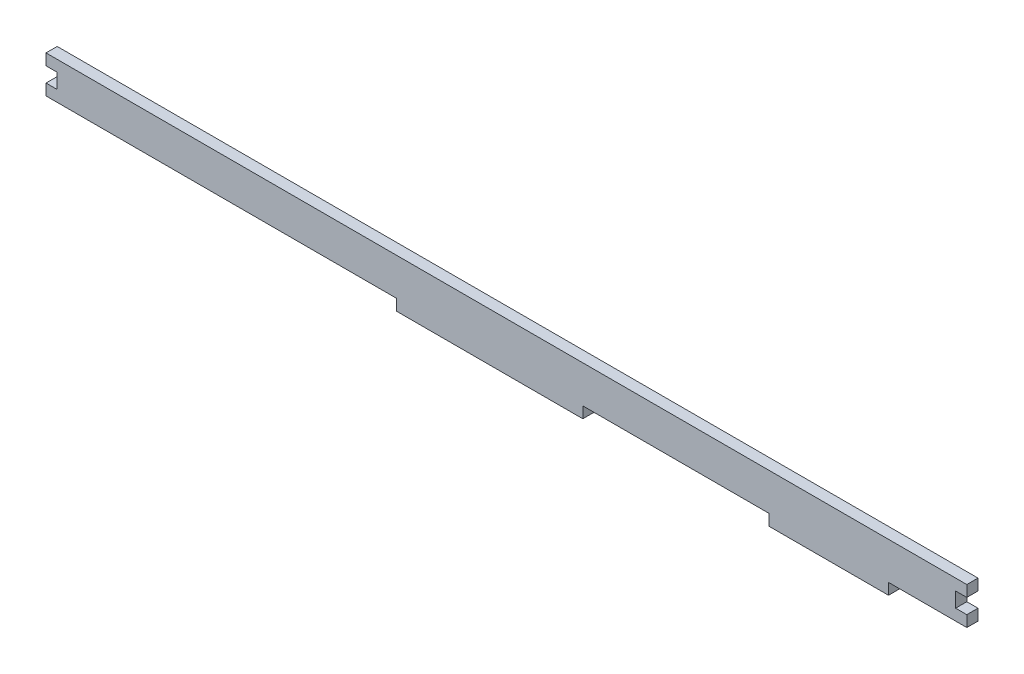
ISO-10303-21;
HEADER;
FILE_DESCRIPTION(('STEP AP214'),'2;1');
FILE_NAME('part.step','',(''),(''),'','','');
FILE_SCHEMA(('AUTOMOTIVE_DESIGN { 1 0 10303 214 1 1 1 1 }'));
ENDSEC;
DATA;
#1=APPLICATION_CONTEXT('core data for automotive mechanical design processes');
#2=APPLICATION_PROTOCOL_DEFINITION('international standard','automotive_design',2000,#1);
#3=PRODUCT_CONTEXT('',#1,'mechanical');
#4=PRODUCT('Part','Part','',(#3));
#5=PRODUCT_RELATED_PRODUCT_CATEGORY('part','',(#4));
#6=PRODUCT_DEFINITION_FORMATION('','',#4);
#7=PRODUCT_DEFINITION_CONTEXT('part definition',#1,'design');
#8=PRODUCT_DEFINITION('design','',#6,#7);
#9=PRODUCT_DEFINITION_SHAPE('','',#8);
#10=(LENGTH_UNIT() NAMED_UNIT(*) SI_UNIT(.MILLI.,.METRE.));
#11=(NAMED_UNIT(*) PLANE_ANGLE_UNIT() SI_UNIT($,.RADIAN.));
#12=(NAMED_UNIT(*) SI_UNIT($,.STERADIAN.) SOLID_ANGLE_UNIT());
#13=UNCERTAINTY_MEASURE_WITH_UNIT(LENGTH_MEASURE(1.E-05),#10,'distance_accuracy_value','');
#14=(GEOMETRIC_REPRESENTATION_CONTEXT(3) GLOBAL_UNCERTAINTY_ASSIGNED_CONTEXT((#13)) GLOBAL_UNIT_ASSIGNED_CONTEXT((#10,
#11,#12)) REPRESENTATION_CONTEXT('',''));
#15=CARTESIAN_POINT('',(0.,0.,0.));
#16=DIRECTION('',(0.,0.,1.));
#17=DIRECTION('',(1.,0.,0.));
#18=AXIS2_PLACEMENT_3D('',#15,#16,#17);
#19=CARTESIAN_POINT('',(247.,10.,3.));
#20=DIRECTION('',(-1.,0.,0.));
#21=DIRECTION('',(0.,0.,1.));
#22=AXIS2_PLACEMENT_3D('',#19,#20,#21);
#23=PLANE('',#22);
#24=DIRECTION('',(0.,1.,0.));
#25=VECTOR('',#24,1.);
#26=CARTESIAN_POINT('',(247.,10.,0.));
#27=LINE('',#26,#25);
#28=CARTESIAN_POINT('',(247.,7.,0.));
#29=VERTEX_POINT('',#28);
#30=CARTESIAN_POINT('',(247.,10.,0.));
#31=VERTEX_POINT('',#30);
#32=EDGE_CURVE('E202',#29,#31,#27,.T.);
#33=ORIENTED_EDGE('',*,*,#32,.T.);
#34=DIRECTION('',(0.,0.,-1.));
#35=VECTOR('',#34,1.);
#36=CARTESIAN_POINT('',(247.,10.,3.));
#37=LINE('',#36,#35);
#38=CARTESIAN_POINT('',(247.,10.,3.));
#39=VERTEX_POINT('',#38);
#40=EDGE_CURVE('E11',#39,#31,#37,.T.);
#41=ORIENTED_EDGE('',*,*,#40,.F.);
#42=DIRECTION('',(0.,1.,0.));
#43=VECTOR('',#42,1.);
#44=CARTESIAN_POINT('',(247.,10.,3.));
#45=LINE('',#44,#43);
#46=CARTESIAN_POINT('',(247.,7.,3.));
#47=VERTEX_POINT('',#46);
#48=EDGE_CURVE('E240',#47,#39,#45,.T.);
#49=ORIENTED_EDGE('',*,*,#48,.F.);
#50=DIRECTION('',(0.,0.,-1.));
#51=VECTOR('',#50,1.);
#52=CARTESIAN_POINT('',(247.,7.,3.));
#53=LINE('',#52,#51);
#54=EDGE_CURVE('E198',#47,#29,#53,.T.);
#55=ORIENTED_EDGE('',*,*,#54,.T.);
#56=EDGE_LOOP('',(#33,#41,#49,#55));
#57=FACE_BOUND('',#56,.T.);
#58=ADVANCED_FACE('F34',(#57),#23,.F.);
#59=CARTESIAN_POINT('',(0.,10.,3.));
#60=DIRECTION('',(0.,-1.,0.));
#61=DIRECTION('',(1.,0.,0.));
#62=AXIS2_PLACEMENT_3D('',#59,#60,#61);
#63=PLANE('',#62);
#64=DIRECTION('',(-1.,0.,0.));
#65=VECTOR('',#64,1.);
#66=CARTESIAN_POINT('',(0.,10.,0.));
#67=LINE('',#66,#65);
#68=CARTESIAN_POINT('',(0.,10.,0.));
#69=VERTEX_POINT('',#68);
#70=EDGE_CURVE('E205',#31,#69,#67,.T.);
#71=ORIENTED_EDGE('',*,*,#70,.T.);
#72=DIRECTION('',(0.,0.,-1.));
#73=VECTOR('',#72,1.);
#74=CARTESIAN_POINT('',(0.,10.,3.));
#75=LINE('',#74,#73);
#76=CARTESIAN_POINT('',(0.,10.,3.));
#77=VERTEX_POINT('',#76);
#78=EDGE_CURVE('E42',#77,#69,#75,.T.);
#79=ORIENTED_EDGE('',*,*,#78,.F.);
#80=DIRECTION('',(-1.,0.,0.));
#81=VECTOR('',#80,1.);
#82=CARTESIAN_POINT('',(244.,10.,3.));
#83=LINE('',#82,#81);
#84=EDGE_CURVE('E129',#39,#77,#83,.T.);
#85=ORIENTED_EDGE('',*,*,#84,.F.);
#86=ORIENTED_EDGE('',*,*,#40,.T.);
#87=EDGE_LOOP('',(#71,#79,#85,#86));
#88=FACE_BOUND('',#87,.T.);
#89=ADVANCED_FACE('F358',(#88),#63,.F.);
#90=CARTESIAN_POINT('',(0.,10.,3.));
#91=DIRECTION('',(1.,0.,0.));
#92=DIRECTION('',(0.,1.,0.));
#93=AXIS2_PLACEMENT_3D('',#90,#91,#92);
#94=PLANE('',#93);
#95=DIRECTION('',(0.,-1.,0.));
#96=VECTOR('',#95,1.);
#97=CARTESIAN_POINT('',(0.,10.,0.));
#98=LINE('',#97,#96);
#99=CARTESIAN_POINT('',(0.,6.99999999999999,0.));
#100=VERTEX_POINT('',#99);
#101=EDGE_CURVE('E207',#69,#100,#98,.T.);
#102=ORIENTED_EDGE('',*,*,#101,.T.);
#103=DIRECTION('',(0.,0.,-1.));
#104=VECTOR('',#103,1.);
#105=CARTESIAN_POINT('',(0.,6.99999999999999,3.));
#106=LINE('',#105,#104);
#107=CARTESIAN_POINT('',(0.,6.99999999999999,3.));
#108=VERTEX_POINT('',#107);
#109=EDGE_CURVE('E283',#108,#100,#106,.T.);
#110=ORIENTED_EDGE('',*,*,#109,.F.);
#111=DIRECTION('',(0.,-1.,0.));
#112=VECTOR('',#111,1.);
#113=CARTESIAN_POINT('',(0.,10.,3.));
#114=LINE('',#113,#112);
#115=EDGE_CURVE('E291',#77,#108,#114,.T.);
#116=ORIENTED_EDGE('',*,*,#115,.F.);
#117=ORIENTED_EDGE('',*,*,#78,.T.);
#118=EDGE_LOOP('',(#102,#110,#116,#117));
#119=FACE_BOUND('',#118,.T.);
#120=ADVANCED_FACE('F289',(#119),#94,.F.);
#121=CARTESIAN_POINT('',(0.,6.99999999999999,3.));
#122=DIRECTION('',(0.,1.,0.));
#123=DIRECTION('',(0.,0.,1.));
#124=AXIS2_PLACEMENT_3D('',#121,#122,#123);
#125=PLANE('',#124);
#126=DIRECTION('',(1.,0.,0.));
#127=VECTOR('',#126,1.);
#128=CARTESIAN_POINT('',(0.,6.99999999999999,0.));
#129=LINE('',#128,#127);
#130=CARTESIAN_POINT('',(3.,6.99999999999999,0.));
#131=VERTEX_POINT('',#130);
#132=EDGE_CURVE('E209',#100,#131,#129,.T.);
#133=ORIENTED_EDGE('',*,*,#132,.T.);
#134=DIRECTION('',(0.,0.,-1.));
#135=VECTOR('',#134,1.);
#136=CARTESIAN_POINT('',(3.,6.99999999999999,3.));
#137=LINE('',#136,#135);
#138=CARTESIAN_POINT('',(3.,6.99999999999999,3.));
#139=VERTEX_POINT('',#138);
#140=EDGE_CURVE('E280',#139,#131,#137,.T.);
#141=ORIENTED_EDGE('',*,*,#140,.F.);
#142=DIRECTION('',(1.,0.,0.));
#143=VECTOR('',#142,1.);
#144=CARTESIAN_POINT('',(0.,6.99999999999999,3.));
#145=LINE('',#144,#143);
#146=EDGE_CURVE('E309',#108,#139,#145,.T.);
#147=ORIENTED_EDGE('',*,*,#146,.F.);
#148=ORIENTED_EDGE('',*,*,#109,.T.);
#149=EDGE_LOOP('',(#133,#141,#147,#148));
#150=FACE_BOUND('',#149,.T.);
#151=ADVANCED_FACE('F300',(#150),#125,.F.);
#152=CARTESIAN_POINT('',(3.,6.99999999999999,3.));
#153=DIRECTION('',(1.,0.,0.));
#154=DIRECTION('',(0.,0.,-1.));
#155=AXIS2_PLACEMENT_3D('',#152,#153,#154);
#156=PLANE('',#155);
#157=DIRECTION('',(0.,-1.,0.));
#158=VECTOR('',#157,1.);
#159=CARTESIAN_POINT('',(3.,6.99999999999999,0.));
#160=LINE('',#159,#158);
#161=CARTESIAN_POINT('',(3.,2.99999999999992,0.));
#162=VERTEX_POINT('',#161);
#163=EDGE_CURVE('E211',#131,#162,#160,.T.);
#164=ORIENTED_EDGE('',*,*,#163,.T.);
#165=DIRECTION('',(0.,0.,-1.));
#166=VECTOR('',#165,1.);
#167=CARTESIAN_POINT('',(3.,2.99999999999992,3.));
#168=LINE('',#167,#166);
#169=CARTESIAN_POINT('',(3.,2.99999999999992,3.));
#170=VERTEX_POINT('',#169);
#171=EDGE_CURVE('E277',#170,#162,#168,.T.);
#172=ORIENTED_EDGE('',*,*,#171,.F.);
#173=DIRECTION('',(0.,-1.,0.));
#174=VECTOR('',#173,1.);
#175=CARTESIAN_POINT('',(3.,6.99999999999999,3.));
#176=LINE('',#175,#174);
#177=EDGE_CURVE('E306',#139,#170,#176,.T.);
#178=ORIENTED_EDGE('',*,*,#177,.F.);
#179=ORIENTED_EDGE('',*,*,#140,.T.);
#180=EDGE_LOOP('',(#164,#172,#178,#179));
#181=FACE_BOUND('',#180,.T.);
#182=ADVANCED_FACE('F304',(#181),#156,.F.);
#183=CARTESIAN_POINT('',(0.,2.99999999999992,3.));
#184=DIRECTION('',(0.,-1.,0.));
#185=DIRECTION('',(1.,0.,0.));
#186=AXIS2_PLACEMENT_3D('',#183,#184,#185);
#187=PLANE('',#186);
#188=DIRECTION('',(-1.,0.,0.));
#189=VECTOR('',#188,1.);
#190=CARTESIAN_POINT('',(0.,2.99999999999992,0.));
#191=LINE('',#190,#189);
#192=CARTESIAN_POINT('',(0.,2.99999999999992,0.));
#193=VERTEX_POINT('',#192);
#194=EDGE_CURVE('E213',#162,#193,#191,.T.);
#195=ORIENTED_EDGE('',*,*,#194,.T.);
#196=DIRECTION('',(0.,0.,-1.));
#197=VECTOR('',#196,1.);
#198=CARTESIAN_POINT('',(0.,2.99999999999992,3.));
#199=LINE('',#198,#197);
#200=CARTESIAN_POINT('',(0.,2.99999999999992,3.));
#201=VERTEX_POINT('',#200);
#202=EDGE_CURVE('E274',#201,#193,#199,.T.);
#203=ORIENTED_EDGE('',*,*,#202,.F.);
#204=DIRECTION('',(-1.,0.,0.));
#205=VECTOR('',#204,1.);
#206=CARTESIAN_POINT('',(0.,2.99999999999992,3.));
#207=LINE('',#206,#205);
#208=EDGE_CURVE('E308',#170,#201,#207,.T.);
#209=ORIENTED_EDGE('',*,*,#208,.F.);
#210=ORIENTED_EDGE('',*,*,#171,.T.);
#211=EDGE_LOOP('',(#195,#203,#209,#210));
#212=FACE_BOUND('',#211,.T.);
#213=ADVANCED_FACE('F371',(#212),#187,.F.);
#214=CARTESIAN_POINT('',(0.,2.99999999999992,3.));
#215=DIRECTION('',(1.,0.,0.));
#216=DIRECTION('',(0.,0.,-1.));
#217=AXIS2_PLACEMENT_3D('',#214,#215,#216);
#218=PLANE('',#217);
#219=DIRECTION('',(0.,-1.,0.));
#220=VECTOR('',#219,1.);
#221=CARTESIAN_POINT('',(0.,2.99999999999992,0.));
#222=LINE('',#221,#220);
#223=CARTESIAN_POINT('',(0.,0.,0.));
#224=VERTEX_POINT('',#223);
#225=EDGE_CURVE('E215',#193,#224,#222,.T.);
#226=ORIENTED_EDGE('',*,*,#225,.T.);
#227=DIRECTION('',(0.,0.,-1.));
#228=VECTOR('',#227,1.);
#229=CARTESIAN_POINT('',(0.,0.,3.));
#230=LINE('',#229,#228);
#231=CARTESIAN_POINT('',(0.,0.,3.));
#232=VERTEX_POINT('',#231);
#233=EDGE_CURVE('E271',#232,#224,#230,.T.);
#234=ORIENTED_EDGE('',*,*,#233,.F.);
#235=DIRECTION('',(0.,-1.,0.));
#236=VECTOR('',#235,1.);
#237=CARTESIAN_POINT('',(0.,2.99999999999992,3.));
#238=LINE('',#237,#236);
#239=EDGE_CURVE('E311',#201,#232,#238,.T.);
#240=ORIENTED_EDGE('',*,*,#239,.F.);
#241=ORIENTED_EDGE('',*,*,#202,.T.);
#242=EDGE_LOOP('',(#226,#234,#240,#241));
#243=FACE_BOUND('',#242,.T.);
#244=ADVANCED_FACE('F374',(#243),#218,.F.);
#245=CARTESIAN_POINT('',(94.,0.,3.));
#246=DIRECTION('',(0.,1.,0.));
#247=DIRECTION('',(-1.,0.,0.));
#248=AXIS2_PLACEMENT_3D('',#245,#246,#247);
#249=PLANE('',#248);
#250=DIRECTION('',(1.,0.,0.));
#251=VECTOR('',#250,1.);
#252=CARTESIAN_POINT('',(94.,0.,0.));
#253=LINE('',#252,#251);
#254=CARTESIAN_POINT('',(94.,0.,0.));
#255=VERTEX_POINT('',#254);
#256=EDGE_CURVE('E217',#224,#255,#253,.T.);
#257=ORIENTED_EDGE('',*,*,#256,.T.);
#258=DIRECTION('',(0.,0.,-1.));
#259=VECTOR('',#258,1.);
#260=CARTESIAN_POINT('',(94.,0.,3.));
#261=LINE('',#260,#259);
#262=CARTESIAN_POINT('',(94.,0.,3.));
#263=VERTEX_POINT('',#262);
#264=EDGE_CURVE('E268',#263,#255,#261,.T.);
#265=ORIENTED_EDGE('',*,*,#264,.F.);
#266=DIRECTION('',(1.,0.,0.));
#267=VECTOR('',#266,1.);
#268=CARTESIAN_POINT('',(94.,0.,3.));
#269=LINE('',#268,#267);
#270=EDGE_CURVE('E317',#232,#263,#269,.T.);
#271=ORIENTED_EDGE('',*,*,#270,.F.);
#272=ORIENTED_EDGE('',*,*,#233,.T.);
#273=EDGE_LOOP('',(#257,#265,#271,#272));
#274=FACE_BOUND('',#273,.T.);
#275=ADVANCED_FACE('F378',(#274),#249,.F.);
#276=CARTESIAN_POINT('',(94.,0.,3.));
#277=DIRECTION('',(1.,0.,0.));
#278=DIRECTION('',(0.,0.,-1.));
#279=AXIS2_PLACEMENT_3D('',#276,#277,#278);
#280=PLANE('',#279);
#281=DIRECTION('',(0.,-1.,0.));
#282=VECTOR('',#281,1.);
#283=CARTESIAN_POINT('',(94.,0.,0.));
#284=LINE('',#283,#282);
#285=CARTESIAN_POINT('',(94.,-2.99999999999999,0.));
#286=VERTEX_POINT('',#285);
#287=EDGE_CURVE('E219',#255,#286,#284,.T.);
#288=ORIENTED_EDGE('',*,*,#287,.T.);
#289=DIRECTION('',(0.,0.,-1.));
#290=VECTOR('',#289,1.);
#291=CARTESIAN_POINT('',(94.,-2.99999999999999,3.));
#292=LINE('',#291,#290);
#293=CARTESIAN_POINT('',(94.,-2.99999999999999,3.));
#294=VERTEX_POINT('',#293);
#295=EDGE_CURVE('E265',#294,#286,#292,.T.);
#296=ORIENTED_EDGE('',*,*,#295,.F.);
#297=DIRECTION('',(0.,-1.,0.));
#298=VECTOR('',#297,1.);
#299=CARTESIAN_POINT('',(94.,0.,3.));
#300=LINE('',#299,#298);
#301=EDGE_CURVE('E319',#263,#294,#300,.T.);
#302=ORIENTED_EDGE('',*,*,#301,.F.);
#303=ORIENTED_EDGE('',*,*,#264,.T.);
#304=EDGE_LOOP('',(#288,#296,#302,#303));
#305=FACE_BOUND('',#304,.T.);
#306=ADVANCED_FACE('F382',(#305),#280,.F.);
#307=CARTESIAN_POINT('',(94.,-2.99999999999999,3.));
#308=DIRECTION('',(0.,1.,0.));
#309=DIRECTION('',(-1.,0.,0.));
#310=AXIS2_PLACEMENT_3D('',#307,#308,#309);
#311=PLANE('',#310);
#312=DIRECTION('',(1.,0.,0.));
#313=VECTOR('',#312,1.);
#314=CARTESIAN_POINT('',(94.,-2.99999999999999,0.));
#315=LINE('',#314,#313);
#316=CARTESIAN_POINT('',(144.,-2.99999999999999,0.));
#317=VERTEX_POINT('',#316);
#318=EDGE_CURVE('E221',#286,#317,#315,.T.);
#319=ORIENTED_EDGE('',*,*,#318,.T.);
#320=DIRECTION('',(0.,0.,-1.));
#321=VECTOR('',#320,1.);
#322=CARTESIAN_POINT('',(144.,-2.99999999999999,3.));
#323=LINE('',#322,#321);
#324=CARTESIAN_POINT('',(144.,-2.99999999999999,3.));
#325=VERTEX_POINT('',#324);
#326=EDGE_CURVE('E262',#325,#317,#323,.T.);
#327=ORIENTED_EDGE('',*,*,#326,.F.);
#328=DIRECTION('',(1.,0.,0.));
#329=VECTOR('',#328,1.);
#330=CARTESIAN_POINT('',(94.,-2.99999999999999,3.));
#331=LINE('',#330,#329);
#332=EDGE_CURVE('E321',#294,#325,#331,.T.);
#333=ORIENTED_EDGE('',*,*,#332,.F.);
#334=ORIENTED_EDGE('',*,*,#295,.T.);
#335=EDGE_LOOP('',(#319,#327,#333,#334));
#336=FACE_BOUND('',#335,.T.);
#337=ADVANCED_FACE('F386',(#336),#311,.F.);
#338=CARTESIAN_POINT('',(144.,0.,3.));
#339=DIRECTION('',(-1.,0.,0.));
#340=DIRECTION('',(0.,0.,1.));
#341=AXIS2_PLACEMENT_3D('',#338,#339,#340);
#342=PLANE('',#341);
#343=DIRECTION('',(0.,1.,0.));
#344=VECTOR('',#343,1.);
#345=CARTESIAN_POINT('',(144.,0.,0.));
#346=LINE('',#345,#344);
#347=CARTESIAN_POINT('',(144.,0.,0.));
#348=VERTEX_POINT('',#347);
#349=EDGE_CURVE('E223',#317,#348,#346,.T.);
#350=ORIENTED_EDGE('',*,*,#349,.T.);
#351=DIRECTION('',(0.,0.,-1.));
#352=VECTOR('',#351,1.);
#353=CARTESIAN_POINT('',(144.,0.,3.));
#354=LINE('',#353,#352);
#355=CARTESIAN_POINT('',(144.,0.,3.));
#356=VERTEX_POINT('',#355);
#357=EDGE_CURVE('E259',#356,#348,#354,.T.);
#358=ORIENTED_EDGE('',*,*,#357,.F.);
#359=DIRECTION('',(0.,1.,0.));
#360=VECTOR('',#359,1.);
#361=CARTESIAN_POINT('',(144.,0.,3.));
#362=LINE('',#361,#360);
#363=EDGE_CURVE('E323',#325,#356,#362,.T.);
#364=ORIENTED_EDGE('',*,*,#363,.F.);
#365=ORIENTED_EDGE('',*,*,#326,.T.);
#366=EDGE_LOOP('',(#350,#358,#364,#365));
#367=FACE_BOUND('',#366,.T.);
#368=ADVANCED_FACE('F390',(#367),#342,.F.);
#369=CARTESIAN_POINT('',(144.,0.,3.));
#370=DIRECTION('',(0.,1.,0.));
#371=DIRECTION('',(-1.,0.,0.));
#372=AXIS2_PLACEMENT_3D('',#369,#370,#371);
#373=PLANE('',#372);
#374=DIRECTION('',(1.,0.,0.));
#375=VECTOR('',#374,1.);
#376=CARTESIAN_POINT('',(144.,0.,0.));
#377=LINE('',#376,#375);
#378=CARTESIAN_POINT('',(194.,0.,0.));
#379=VERTEX_POINT('',#378);
#380=EDGE_CURVE('E225',#348,#379,#377,.T.);
#381=ORIENTED_EDGE('',*,*,#380,.T.);
#382=DIRECTION('',(0.,0.,-1.));
#383=VECTOR('',#382,1.);
#384=CARTESIAN_POINT('',(194.,0.,3.));
#385=LINE('',#384,#383);
#386=CARTESIAN_POINT('',(194.,0.,3.));
#387=VERTEX_POINT('',#386);
#388=EDGE_CURVE('E256',#387,#379,#385,.T.);
#389=ORIENTED_EDGE('',*,*,#388,.F.);
#390=DIRECTION('',(1.,0.,0.));
#391=VECTOR('',#390,1.);
#392=CARTESIAN_POINT('',(144.,0.,3.));
#393=LINE('',#392,#391);
#394=EDGE_CURVE('E325',#356,#387,#393,.T.);
#395=ORIENTED_EDGE('',*,*,#394,.F.);
#396=ORIENTED_EDGE('',*,*,#357,.T.);
#397=EDGE_LOOP('',(#381,#389,#395,#396));
#398=FACE_BOUND('',#397,.T.);
#399=ADVANCED_FACE('F394',(#398),#373,.F.);
#400=CARTESIAN_POINT('',(194.,0.,3.));
#401=DIRECTION('',(1.,0.,0.));
#402=DIRECTION('',(0.,1.,0.));
#403=AXIS2_PLACEMENT_3D('',#400,#401,#402);
#404=PLANE('',#403);
#405=DIRECTION('',(0.,-1.,0.));
#406=VECTOR('',#405,1.);
#407=CARTESIAN_POINT('',(194.,0.,0.));
#408=LINE('',#407,#406);
#409=CARTESIAN_POINT('',(194.,-2.99999999999999,0.));
#410=VERTEX_POINT('',#409);
#411=EDGE_CURVE('E227',#379,#410,#408,.T.);
#412=ORIENTED_EDGE('',*,*,#411,.T.);
#413=DIRECTION('',(0.,0.,-1.));
#414=VECTOR('',#413,1.);
#415=CARTESIAN_POINT('',(194.,-2.99999999999999,3.));
#416=LINE('',#415,#414);
#417=CARTESIAN_POINT('',(194.,-2.99999999999999,3.));
#418=VERTEX_POINT('',#417);
#419=EDGE_CURVE('E253',#418,#410,#416,.T.);
#420=ORIENTED_EDGE('',*,*,#419,.F.);
#421=DIRECTION('',(0.,-1.,0.));
#422=VECTOR('',#421,1.);
#423=CARTESIAN_POINT('',(194.,0.,3.));
#424=LINE('',#423,#422);
#425=EDGE_CURVE('E327',#387,#418,#424,.T.);
#426=ORIENTED_EDGE('',*,*,#425,.F.);
#427=ORIENTED_EDGE('',*,*,#388,.T.);
#428=EDGE_LOOP('',(#412,#420,#426,#427));
#429=FACE_BOUND('',#428,.T.);
#430=ADVANCED_FACE('F398',(#429),#404,.F.);
#431=CARTESIAN_POINT('',(194.,-2.99999999999999,3.));
#432=DIRECTION('',(0.,1.,0.));
#433=DIRECTION('',(-1.,0.,0.));
#434=AXIS2_PLACEMENT_3D('',#431,#432,#433);
#435=PLANE('',#434);
#436=DIRECTION('',(1.,0.,0.));
#437=VECTOR('',#436,1.);
#438=CARTESIAN_POINT('',(194.,-2.99999999999999,0.));
#439=LINE('',#438,#437);
#440=CARTESIAN_POINT('',(226.,-2.99999999999999,0.));
#441=VERTEX_POINT('',#440);
#442=EDGE_CURVE('E229',#410,#441,#439,.T.);
#443=ORIENTED_EDGE('',*,*,#442,.T.);
#444=DIRECTION('',(0.,0.,-1.));
#445=VECTOR('',#444,1.);
#446=CARTESIAN_POINT('',(226.,-2.99999999999999,3.));
#447=LINE('',#446,#445);
#448=CARTESIAN_POINT('',(226.,-2.99999999999999,3.));
#449=VERTEX_POINT('',#448);
#450=EDGE_CURVE('E250',#449,#441,#447,.T.);
#451=ORIENTED_EDGE('',*,*,#450,.F.);
#452=DIRECTION('',(1.,0.,0.));
#453=VECTOR('',#452,1.);
#454=CARTESIAN_POINT('',(194.,-2.99999999999999,3.));
#455=LINE('',#454,#453);
#456=EDGE_CURVE('E329',#418,#449,#455,.T.);
#457=ORIENTED_EDGE('',*,*,#456,.F.);
#458=ORIENTED_EDGE('',*,*,#419,.T.);
#459=EDGE_LOOP('',(#443,#451,#457,#458));
#460=FACE_BOUND('',#459,.T.);
#461=ADVANCED_FACE('F402',(#460),#435,.F.);
#462=CARTESIAN_POINT('',(226.,0.,3.));
#463=DIRECTION('',(-1.,0.,0.));
#464=DIRECTION('',(0.,0.,1.));
#465=AXIS2_PLACEMENT_3D('',#462,#463,#464);
#466=PLANE('',#465);
#467=DIRECTION('',(0.,1.,0.));
#468=VECTOR('',#467,1.);
#469=CARTESIAN_POINT('',(226.,0.,0.));
#470=LINE('',#469,#468);
#471=CARTESIAN_POINT('',(226.,0.,0.));
#472=VERTEX_POINT('',#471);
#473=EDGE_CURVE('E231',#441,#472,#470,.T.);
#474=ORIENTED_EDGE('',*,*,#473,.T.);
#475=DIRECTION('',(0.,0.,-1.));
#476=VECTOR('',#475,1.);
#477=CARTESIAN_POINT('',(226.,0.,3.));
#478=LINE('',#477,#476);
#479=CARTESIAN_POINT('',(226.,0.,3.));
#480=VERTEX_POINT('',#479);
#481=EDGE_CURVE('E247',#480,#472,#478,.T.);
#482=ORIENTED_EDGE('',*,*,#481,.F.);
#483=DIRECTION('',(0.,1.,0.));
#484=VECTOR('',#483,1.);
#485=CARTESIAN_POINT('',(226.,0.,3.));
#486=LINE('',#485,#484);
#487=EDGE_CURVE('E331',#449,#480,#486,.T.);
#488=ORIENTED_EDGE('',*,*,#487,.F.);
#489=ORIENTED_EDGE('',*,*,#450,.T.);
#490=EDGE_LOOP('',(#474,#482,#488,#489));
#491=FACE_BOUND('',#490,.T.);
#492=ADVANCED_FACE('F406',(#491),#466,.F.);
#493=CARTESIAN_POINT('',(226.,0.,3.));
#494=DIRECTION('',(0.,1.,0.));
#495=DIRECTION('',(0.,0.,1.));
#496=AXIS2_PLACEMENT_3D('',#493,#494,#495);
#497=PLANE('',#496);
#498=DIRECTION('',(1.,0.,0.));
#499=VECTOR('',#498,1.);
#500=CARTESIAN_POINT('',(226.,0.,0.));
#501=LINE('',#500,#499);
#502=CARTESIAN_POINT('',(247.,0.,0.));
#503=VERTEX_POINT('',#502);
#504=EDGE_CURVE('E233',#472,#503,#501,.T.);
#505=ORIENTED_EDGE('',*,*,#504,.T.);
#506=DIRECTION('',(0.,0.,-1.));
#507=VECTOR('',#506,1.);
#508=CARTESIAN_POINT('',(247.,0.,3.));
#509=LINE('',#508,#507);
#510=CARTESIAN_POINT('',(247.,0.,3.));
#511=VERTEX_POINT('',#510);
#512=EDGE_CURVE('E244',#511,#503,#509,.T.);
#513=ORIENTED_EDGE('',*,*,#512,.F.);
#514=DIRECTION('',(1.,0.,0.));
#515=VECTOR('',#514,1.);
#516=CARTESIAN_POINT('',(226.,0.,3.));
#517=LINE('',#516,#515);
#518=EDGE_CURVE('E333',#480,#511,#517,.T.);
#519=ORIENTED_EDGE('',*,*,#518,.F.);
#520=ORIENTED_EDGE('',*,*,#481,.T.);
#521=EDGE_LOOP('',(#505,#513,#519,#520));
#522=FACE_BOUND('',#521,.T.);
#523=ADVANCED_FACE('F339',(#522),#497,.F.);
#524=CARTESIAN_POINT('',(247.,0.,3.));
#525=DIRECTION('',(-1.,0.,0.));
#526=DIRECTION('',(0.,0.,1.));
#527=AXIS2_PLACEMENT_3D('',#524,#525,#526);
#528=PLANE('',#527);
#529=DIRECTION('',(0.,1.,0.));
#530=VECTOR('',#529,1.);
#531=CARTESIAN_POINT('',(247.,0.,0.));
#532=LINE('',#531,#530);
#533=CARTESIAN_POINT('',(247.,2.99999999999992,0.));
#534=VERTEX_POINT('',#533);
#535=EDGE_CURVE('E235',#503,#534,#532,.T.);
#536=ORIENTED_EDGE('',*,*,#535,.T.);
#537=DIRECTION('',(0.,0.,-1.));
#538=VECTOR('',#537,1.);
#539=CARTESIAN_POINT('',(247.,2.99999999999992,3.));
#540=LINE('',#539,#538);
#541=CARTESIAN_POINT('',(247.,2.99999999999992,3.));
#542=VERTEX_POINT('',#541);
#543=EDGE_CURVE('E193',#542,#534,#540,.T.);
#544=ORIENTED_EDGE('',*,*,#543,.F.);
#545=DIRECTION('',(0.,1.,0.));
#546=VECTOR('',#545,1.);
#547=CARTESIAN_POINT('',(247.,0.,3.));
#548=LINE('',#547,#546);
#549=EDGE_CURVE('E184',#511,#542,#548,.T.);
#550=ORIENTED_EDGE('',*,*,#549,.F.);
#551=ORIENTED_EDGE('',*,*,#512,.T.);
#552=EDGE_LOOP('',(#536,#544,#550,#551));
#553=FACE_BOUND('',#552,.T.);
#554=ADVANCED_FACE('F343',(#553),#528,.F.);
#555=CARTESIAN_POINT('',(244.,2.99999999999992,3.));
#556=DIRECTION('',(0.,-1.,0.));
#557=DIRECTION('',(0.,0.,-1.));
#558=AXIS2_PLACEMENT_3D('',#555,#556,#557);
#559=PLANE('',#558);
#560=DIRECTION('',(-1.,0.,0.));
#561=VECTOR('',#560,1.);
#562=CARTESIAN_POINT('',(244.,2.99999999999992,0.));
#563=LINE('',#562,#561);
#564=CARTESIAN_POINT('',(244.,2.99999999999992,0.));
#565=VERTEX_POINT('',#564);
#566=EDGE_CURVE('E192',#534,#565,#563,.T.);
#567=ORIENTED_EDGE('',*,*,#566,.T.);
#568=DIRECTION('',(0.,0.,-1.));
#569=VECTOR('',#568,1.);
#570=CARTESIAN_POINT('',(244.,2.99999999999992,3.));
#571=LINE('',#570,#569);
#572=CARTESIAN_POINT('',(244.,2.99999999999992,3.));
#573=VERTEX_POINT('',#572);
#574=EDGE_CURVE('E189',#573,#565,#571,.T.);
#575=ORIENTED_EDGE('',*,*,#574,.F.);
#576=DIRECTION('',(-1.,0.,0.));
#577=VECTOR('',#576,1.);
#578=CARTESIAN_POINT('',(244.,2.99999999999992,3.));
#579=LINE('',#578,#577);
#580=EDGE_CURVE('E178',#542,#573,#579,.T.);
#581=ORIENTED_EDGE('',*,*,#580,.F.);
#582=ORIENTED_EDGE('',*,*,#543,.T.);
#583=EDGE_LOOP('',(#567,#575,#581,#582));
#584=FACE_BOUND('',#583,.T.);
#585=ADVANCED_FACE('F190',(#584),#559,.F.);
#586=CARTESIAN_POINT('',(244.,7.,3.));
#587=DIRECTION('',(-1.,0.,0.));
#588=DIRECTION('',(0.,0.,1.));
#589=AXIS2_PLACEMENT_3D('',#586,#587,#588);
#590=PLANE('',#589);
#591=DIRECTION('',(0.,1.,0.));
#592=VECTOR('',#591,1.);
#593=CARTESIAN_POINT('',(244.,7.,0.));
#594=LINE('',#593,#592);
#595=CARTESIAN_POINT('',(244.,7.,0.));
#596=VERTEX_POINT('',#595);
#597=EDGE_CURVE('E115',#565,#596,#594,.T.);
#598=ORIENTED_EDGE('',*,*,#597,.T.);
#599=DIRECTION('',(0.,0.,-1.));
#600=VECTOR('',#599,1.);
#601=CARTESIAN_POINT('',(244.,7.,3.));
#602=LINE('',#601,#600);
#603=CARTESIAN_POINT('',(244.,7.,3.));
#604=VERTEX_POINT('',#603);
#605=EDGE_CURVE('E194',#604,#596,#602,.T.);
#606=ORIENTED_EDGE('',*,*,#605,.F.);
#607=DIRECTION('',(0.,1.,0.));
#608=VECTOR('',#607,1.);
#609=CARTESIAN_POINT('',(244.,7.,3.));
#610=LINE('',#609,#608);
#611=EDGE_CURVE('E182',#573,#604,#610,.T.);
#612=ORIENTED_EDGE('',*,*,#611,.F.);
#613=ORIENTED_EDGE('',*,*,#574,.T.);
#614=EDGE_LOOP('',(#598,#606,#612,#613));
#615=FACE_BOUND('',#614,.T.);
#616=ADVANCED_FACE('F196',(#615),#590,.F.);
#617=CARTESIAN_POINT('',(244.,7.,3.));
#618=DIRECTION('',(0.,1.,0.));
#619=DIRECTION('',(-1.,0.,0.));
#620=AXIS2_PLACEMENT_3D('',#617,#618,#619);
#621=PLANE('',#620);
#622=DIRECTION('',(1.,0.,0.));
#623=VECTOR('',#622,1.);
#624=CARTESIAN_POINT('',(244.,7.,0.));
#625=LINE('',#624,#623);
#626=EDGE_CURVE('E121',#596,#29,#625,.T.);
#627=ORIENTED_EDGE('',*,*,#626,.T.);
#628=ORIENTED_EDGE('',*,*,#54,.F.);
#629=DIRECTION('',(1.,0.,0.));
#630=VECTOR('',#629,1.);
#631=CARTESIAN_POINT('',(244.,7.,3.));
#632=LINE('',#631,#630);
#633=EDGE_CURVE('E50',#604,#47,#632,.T.);
#634=ORIENTED_EDGE('',*,*,#633,.F.);
#635=ORIENTED_EDGE('',*,*,#605,.T.);
#636=EDGE_LOOP('',(#627,#628,#634,#635));
#637=FACE_BOUND('',#636,.T.);
#638=ADVANCED_FACE('F347',(#637),#621,.F.);
#639=CARTESIAN_POINT('',(0.,0.,3.));
#640=DIRECTION('',(0.,0.,1.));
#641=DIRECTION('',(1.,0.,0.));
#642=AXIS2_PLACEMENT_3D('',#639,#640,#641);
#643=PLANE('',#642);
#644=ORIENTED_EDGE('',*,*,#48,.T.);
#645=ORIENTED_EDGE('',*,*,#84,.T.);
#646=ORIENTED_EDGE('',*,*,#115,.T.);
#647=ORIENTED_EDGE('',*,*,#146,.T.);
#648=ORIENTED_EDGE('',*,*,#177,.T.);
#649=ORIENTED_EDGE('',*,*,#208,.T.);
#650=ORIENTED_EDGE('',*,*,#239,.T.);
#651=ORIENTED_EDGE('',*,*,#270,.T.);
#652=ORIENTED_EDGE('',*,*,#301,.T.);
#653=ORIENTED_EDGE('',*,*,#332,.T.);
#654=ORIENTED_EDGE('',*,*,#363,.T.);
#655=ORIENTED_EDGE('',*,*,#394,.T.);
#656=ORIENTED_EDGE('',*,*,#425,.T.);
#657=ORIENTED_EDGE('',*,*,#456,.T.);
#658=ORIENTED_EDGE('',*,*,#487,.T.);
#659=ORIENTED_EDGE('',*,*,#518,.T.);
#660=ORIENTED_EDGE('',*,*,#549,.T.);
#661=ORIENTED_EDGE('',*,*,#580,.T.);
#662=ORIENTED_EDGE('',*,*,#611,.T.);
#663=ORIENTED_EDGE('',*,*,#633,.T.);
#664=EDGE_LOOP('',(#644,#645,#646,#647,#648,#649,#650,#651,#652,#653,#654,#655,#656,#657,#658,
#659,#660,#661,#662,#663));
#665=FACE_BOUND('',#664,.T.);
#666=ADVANCED_FACE('F180',(#665),#643,.T.);
#667=CARTESIAN_POINT('',(0.,0.,0.));
#668=DIRECTION('',(0.,0.,1.));
#669=DIRECTION('',(1.,0.,0.));
#670=AXIS2_PLACEMENT_3D('',#667,#668,#669);
#671=PLANE('',#670);
#672=ORIENTED_EDGE('',*,*,#32,.F.);
#673=ORIENTED_EDGE('',*,*,#626,.F.);
#674=ORIENTED_EDGE('',*,*,#597,.F.);
#675=ORIENTED_EDGE('',*,*,#566,.F.);
#676=ORIENTED_EDGE('',*,*,#535,.F.);
#677=ORIENTED_EDGE('',*,*,#504,.F.);
#678=ORIENTED_EDGE('',*,*,#473,.F.);
#679=ORIENTED_EDGE('',*,*,#442,.F.);
#680=ORIENTED_EDGE('',*,*,#411,.F.);
#681=ORIENTED_EDGE('',*,*,#380,.F.);
#682=ORIENTED_EDGE('',*,*,#349,.F.);
#683=ORIENTED_EDGE('',*,*,#318,.F.);
#684=ORIENTED_EDGE('',*,*,#287,.F.);
#685=ORIENTED_EDGE('',*,*,#256,.F.);
#686=ORIENTED_EDGE('',*,*,#225,.F.);
#687=ORIENTED_EDGE('',*,*,#194,.F.);
#688=ORIENTED_EDGE('',*,*,#163,.F.);
#689=ORIENTED_EDGE('',*,*,#132,.F.);
#690=ORIENTED_EDGE('',*,*,#101,.F.);
#691=ORIENTED_EDGE('',*,*,#70,.F.);
#692=EDGE_LOOP('',(#672,#673,#674,#675,#676,#677,#678,#679,#680,#681,#682,#683,#684,#685,#686,
#687,#688,#689,#690,#691));
#693=FACE_BOUND('',#692,.T.);
#694=ADVANCED_FACE('F295',(#693),#671,.F.);
#695=CLOSED_SHELL('',(#58,#89,#120,#151,#182,#213,#244,#275,#306,#337,#368,#399,#430,#461,#492,
#523,#554,#585,#616,#638,#666,#694));
#696=MANIFOLD_SOLID_BREP('B2',#695);
#697=ADVANCED_BREP_SHAPE_REPRESENTATION('',(#18,#696),#14);
#698=SHAPE_DEFINITION_REPRESENTATION(#9,#697);
ENDSEC;
END-ISO-10303-21;
